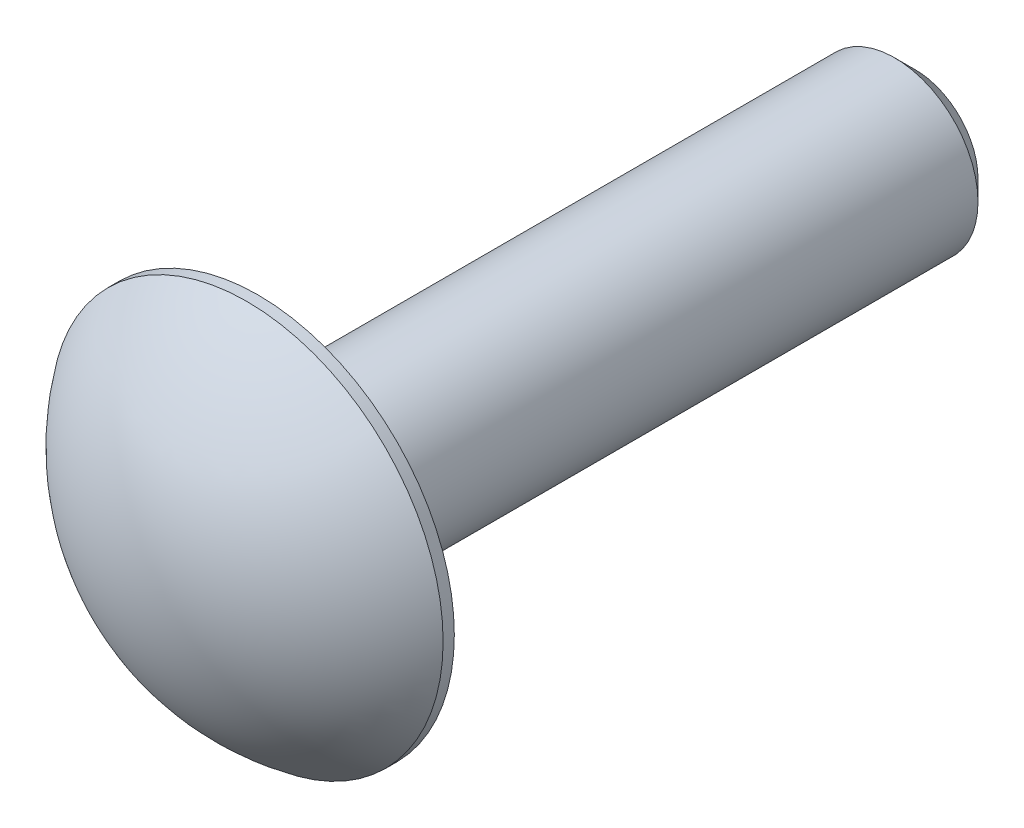
ISO-10303-21;
HEADER;
FILE_DESCRIPTION(('STEP AP214'),'2;1');
FILE_NAME('part.step','',(''),(''),'','','');
FILE_SCHEMA(('AUTOMOTIVE_DESIGN { 1 0 10303 214 1 1 1 1 }'));
ENDSEC;
DATA;
#1=APPLICATION_CONTEXT('core data for automotive mechanical design processes');
#2=APPLICATION_PROTOCOL_DEFINITION('international standard','automotive_design',2000,#1);
#3=PRODUCT_CONTEXT('',#1,'mechanical');
#4=PRODUCT('Part','Part','',(#3));
#5=PRODUCT_RELATED_PRODUCT_CATEGORY('part','',(#4));
#6=PRODUCT_DEFINITION_FORMATION('','',#4);
#7=PRODUCT_DEFINITION_CONTEXT('part definition',#1,'design');
#8=PRODUCT_DEFINITION('design','',#6,#7);
#9=PRODUCT_DEFINITION_SHAPE('','',#8);
#10=(LENGTH_UNIT() NAMED_UNIT(*) SI_UNIT(.MILLI.,.METRE.));
#11=(NAMED_UNIT(*) PLANE_ANGLE_UNIT() SI_UNIT($,.RADIAN.));
#12=(NAMED_UNIT(*) SI_UNIT($,.STERADIAN.) SOLID_ANGLE_UNIT());
#13=UNCERTAINTY_MEASURE_WITH_UNIT(LENGTH_MEASURE(1.E-05),#10,'distance_accuracy_value','');
#14=(GEOMETRIC_REPRESENTATION_CONTEXT(3) GLOBAL_UNCERTAINTY_ASSIGNED_CONTEXT((#13)) GLOBAL_UNIT_ASSIGNED_CONTEXT((#10,
#11,#12)) REPRESENTATION_CONTEXT('',''));
#15=CARTESIAN_POINT('',(0.,0.,0.));
#16=DIRECTION('',(0.,0.,1.));
#17=DIRECTION('',(1.,0.,0.));
#18=AXIS2_PLACEMENT_3D('',#15,#16,#17);
#19=CARTESIAN_POINT('',(0.,0.,0.));
#20=DIRECTION('',(0.,0.,1.));
#21=DIRECTION('',(1.,0.,0.));
#22=AXIS2_PLACEMENT_3D('',#19,#20,#21);
#23=PLANE('',#22);
#24=CARTESIAN_POINT('',(0.,0.,0.));
#25=DIRECTION('',(0.,0.,1.));
#26=DIRECTION('',(1.,0.,0.));
#27=AXIS2_PLACEMENT_3D('',#24,#25,#26);
#28=CIRCLE('',#27,5.6896);
#29=CARTESIAN_POINT('',(5.6896,0.,0.));
#30=VERTEX_POINT('',#29);
#31=EDGE_CURVE('E47',#30,#30,#28,.T.);
#32=ORIENTED_EDGE('',*,*,#31,.F.);
#33=EDGE_LOOP('',(#32));
#34=FACE_BOUND('',#33,.T.);
#35=CARTESIAN_POINT('',(0.,0.,0.));
#36=DIRECTION('',(0.,0.,1.));
#37=DIRECTION('',(1.,0.,0.));
#38=AXIS2_PLACEMENT_3D('',#35,#36,#37);
#39=CIRCLE('',#38,2.413);
#40=CARTESIAN_POINT('',(2.413,0.,0.));
#41=VERTEX_POINT('',#40);
#42=EDGE_CURVE('E11',#41,#41,#39,.F.);
#43=ORIENTED_EDGE('',*,*,#42,.F.);
#44=EDGE_LOOP('',(#43));
#45=FACE_BOUND('',#44,.T.);
#46=ADVANCED_FACE('F39',(#34,#45),#23,.F.);
#47=CARTESIAN_POINT('',(0.,0.,3.2512));
#48=DIRECTION('',(0.,0.,-1.));
#49=DIRECTION('',(-1.,0.,0.));
#50=AXIS2_PLACEMENT_3D('',#47,#48,#49);
#51=CYLINDRICAL_SURFACE('',#50,5.6896);
#52=CARTESIAN_POINT('',(0.,0.,0.325119999999997));
#53=DIRECTION('',(0.,0.,-1.));
#54=DIRECTION('',(0.,1.,0.));
#55=AXIS2_PLACEMENT_3D('',#52,#53,#54);
#56=CIRCLE('',#55,5.6896);
#57=CARTESIAN_POINT('',(0.,5.6896,0.325119999999997));
#58=VERTEX_POINT('',#57);
#59=EDGE_CURVE('E57',#58,#58,#56,.T.);
#60=ORIENTED_EDGE('',*,*,#59,.T.);
#61=EDGE_LOOP('',(#60));
#62=FACE_BOUND('',#61,.T.);
#63=ORIENTED_EDGE('',*,*,#31,.T.);
#64=EDGE_LOOP('',(#63));
#65=FACE_BOUND('',#64,.T.);
#66=ADVANCED_FACE('F41',(#62,#65),#51,.T.);
#67=CARTESIAN_POINT('',(0.,0.,-3.74339555555555));
#68=DIRECTION('',(0.,0.,-1.));
#69=DIRECTION('',(0.,1.,0.));
#70=AXIS2_PLACEMENT_3D('',#67,#68,#69);
#71=SPHERICAL_SURFACE('',#70,6.99459555555555);
#72=CARTESIAN_POINT('',(0.,0.,3.2512));
#73=VERTEX_POINT('',#72);
#74=VERTEX_LOOP('',#73);
#75=FACE_BOUND('',#74,.T.);
#76=ORIENTED_EDGE('',*,*,#59,.F.);
#77=EDGE_LOOP('',(#76));
#78=FACE_BOUND('',#77,.T.);
#79=ADVANCED_FACE('F50',(#75,#78),#71,.T.);
#80=CARTESIAN_POINT('',(0.,0.,-19.05));
#81=DIRECTION('',(0.,0.,1.));
#82=DIRECTION('',(1.,0.,0.));
#83=AXIS2_PLACEMENT_3D('',#80,#81,#82);
#84=PLANE('',#83);
#85=CARTESIAN_POINT('',(0.,0.,-19.05));
#86=DIRECTION('',(0.,0.,1.));
#87=DIRECTION('',(1.,0.,0.));
#88=AXIS2_PLACEMENT_3D('',#85,#86,#87);
#89=CIRCLE('',#88,1.81768749999999);
#90=CARTESIAN_POINT('',(1.81768749999999,0.,-19.05));
#91=VERTEX_POINT('',#90);
#92=EDGE_CURVE('E60',#91,#91,#89,.F.);
#93=ORIENTED_EDGE('',*,*,#92,.T.);
#94=EDGE_LOOP('',(#93));
#95=FACE_BOUND('',#94,.T.);
#96=ADVANCED_FACE('F53',(#95),#84,.F.);
#97=CARTESIAN_POINT('',(0.,0.,0.));
#98=DIRECTION('',(0.,0.,1.));
#99=DIRECTION('',(1.,0.,0.));
#100=AXIS2_PLACEMENT_3D('',#97,#98,#99);
#101=CYLINDRICAL_SURFACE('',#100,2.413);
#102=CARTESIAN_POINT('',(0.,0.,-18.4546875));
#103=DIRECTION('',(0.,0.,1.));
#104=DIRECTION('',(1.,0.,0.));
#105=AXIS2_PLACEMENT_3D('',#102,#103,#104);
#106=CIRCLE('',#105,2.413);
#107=CARTESIAN_POINT('',(2.413,0.,-18.4546875));
#108=VERTEX_POINT('',#107);
#109=EDGE_CURVE('E66',#108,#108,#106,.T.);
#110=ORIENTED_EDGE('',*,*,#109,.T.);
#111=EDGE_LOOP('',(#110));
#112=FACE_BOUND('',#111,.T.);
#113=ORIENTED_EDGE('',*,*,#42,.T.);
#114=EDGE_LOOP('',(#113));
#115=FACE_BOUND('',#114,.T.);
#116=ADVANCED_FACE('F73',(#112,#115),#101,.T.);
#117=CARTESIAN_POINT('',(0.,0.,-18.4546875));
#118=DIRECTION('',(0.,0.,1.));
#119=DIRECTION('',(1.,0.,0.));
#120=AXIS2_PLACEMENT_3D('',#117,#118,#119);
#121=CONICAL_SURFACE('',#120,2.413,0.78539816339745);
#122=ORIENTED_EDGE('',*,*,#92,.F.);
#123=EDGE_LOOP('',(#122));
#124=FACE_BOUND('',#123,.T.);
#125=ORIENTED_EDGE('',*,*,#109,.F.);
#126=EDGE_LOOP('',(#125));
#127=FACE_BOUND('',#126,.T.);
#128=ADVANCED_FACE('F76',(#124,#127),#121,.T.);
#129=CLOSED_SHELL('',(#46,#66,#79,#96,#116,#128));
#130=MANIFOLD_SOLID_BREP('B2',#129);
#131=ADVANCED_BREP_SHAPE_REPRESENTATION('',(#18,#130),#14);
#132=SHAPE_DEFINITION_REPRESENTATION(#9,#131);
ENDSEC;
END-ISO-10303-21;
